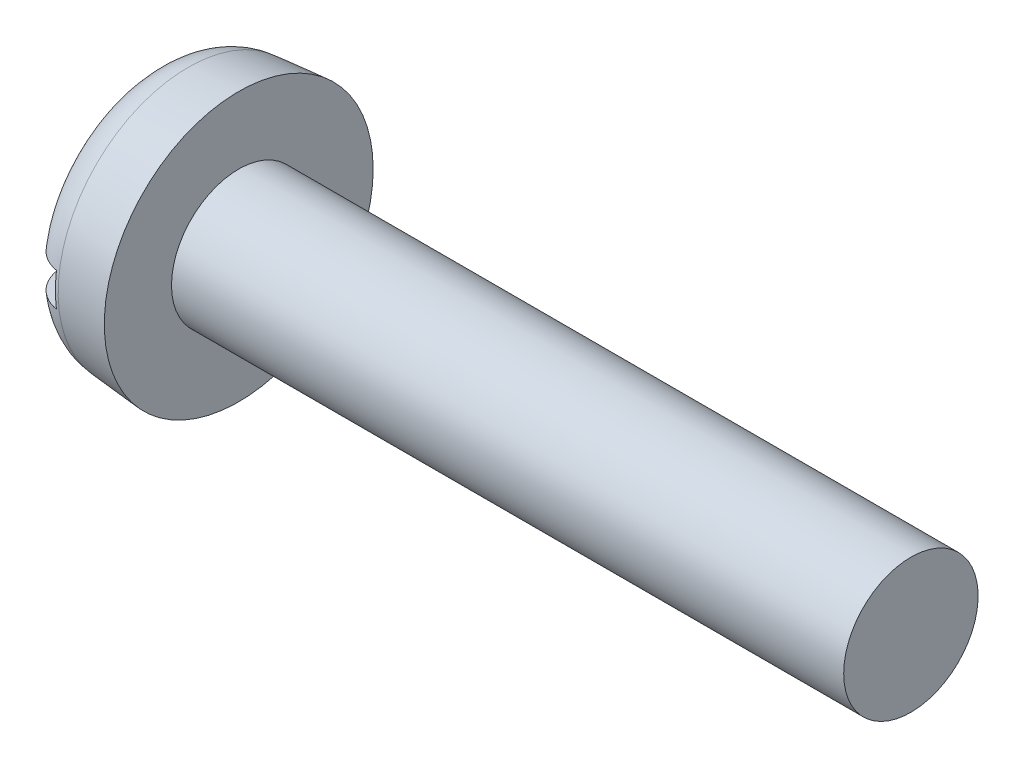
ISO-10303-21;
HEADER;
FILE_DESCRIPTION(('STEP AP214'),'2;1');
FILE_NAME('part.step','',(''),(''),'','','');
FILE_SCHEMA(('AUTOMOTIVE_DESIGN { 1 0 10303 214 1 1 1 1 }'));
ENDSEC;
DATA;
#1=APPLICATION_CONTEXT('core data for automotive mechanical design processes');
#2=APPLICATION_PROTOCOL_DEFINITION('international standard','automotive_design',2000,#1);
#3=PRODUCT_CONTEXT('',#1,'mechanical');
#4=PRODUCT('Part','Part','',(#3));
#5=PRODUCT_RELATED_PRODUCT_CATEGORY('part','',(#4));
#6=PRODUCT_DEFINITION_FORMATION('','',#4);
#7=PRODUCT_DEFINITION_CONTEXT('part definition',#1,'design');
#8=PRODUCT_DEFINITION('design','',#6,#7);
#9=PRODUCT_DEFINITION_SHAPE('','',#8);
#10=(LENGTH_UNIT() NAMED_UNIT(*) SI_UNIT(.MILLI.,.METRE.));
#11=(NAMED_UNIT(*) PLANE_ANGLE_UNIT() SI_UNIT($,.RADIAN.));
#12=(NAMED_UNIT(*) SI_UNIT($,.STERADIAN.) SOLID_ANGLE_UNIT());
#13=UNCERTAINTY_MEASURE_WITH_UNIT(LENGTH_MEASURE(1.E-05),#10,'distance_accuracy_value','');
#14=(GEOMETRIC_REPRESENTATION_CONTEXT(3) GLOBAL_UNCERTAINTY_ASSIGNED_CONTEXT((#13)) GLOBAL_UNIT_ASSIGNED_CONTEXT((#10,
#11,#12)) REPRESENTATION_CONTEXT('',''));
#15=CARTESIAN_POINT('',(0.,0.,0.));
#16=DIRECTION('',(0.,0.,1.));
#17=DIRECTION('',(1.,0.,0.));
#18=AXIS2_PLACEMENT_3D('',#15,#16,#17);
#19=CARTESIAN_POINT('',(0.,0.,0.));
#20=DIRECTION('',(-0.999999999999999,0.,0.));
#21=DIRECTION('',(0.,0.,1.));
#22=AXIS2_PLACEMENT_3D('',#19,#20,#21);
#23=PLANE('',#22);
#24=DIRECTION('',(0.,0.,-1.));
#25=VECTOR('',#24,1.);
#26=CARTESIAN_POINT('',(1.38777878078145E-13,0.25,2.));
#27=LINE('',#26,#25);
#28=CARTESIAN_POINT('',(1.38777878078145E-13,0.25,1.31287526344981));
#29=VERTEX_POINT('',#28);
#30=CARTESIAN_POINT('',(1.38777878078145E-13,0.249999999999993,-1.31287526344981));
#31=VERTEX_POINT('',#30);
#32=EDGE_CURVE('E95',#29,#31,#27,.T.);
#33=ORIENTED_EDGE('',*,*,#32,.F.);
#34=CARTESIAN_POINT('',(0.,0.,0.));
#35=DIRECTION('',(-0.999999999999999,0.,0.));
#36=DIRECTION('',(0.,0.,1.));
#37=AXIS2_PLACEMENT_3D('',#34,#35,#36);
#38=CIRCLE('',#37,1.33646603300584);
#39=EDGE_CURVE('E102',#29,#31,#38,.T.);
#40=ORIENTED_EDGE('',*,*,#39,.T.);
#41=EDGE_LOOP('',(#33,#40));
#42=FACE_BOUND('',#41,.T.);
#43=ADVANCED_FACE('F38',(#42),#23,.T.);
#44=CARTESIAN_POINT('',(-25.4,0.,0.));
#45=DIRECTION('',(-0.999999999999999,0.,0.));
#46=DIRECTION('',(0.,0.,1.));
#47=AXIS2_PLACEMENT_3D('',#44,#45,#46);
#48=CYLINDRICAL_SURFACE('',#47,1.);
#49=CARTESIAN_POINT('',(11.3,-1.2490009027033E-13,0.));
#50=DIRECTION('',(-0.999999999999999,0.,0.));
#51=DIRECTION('',(0.,0.,1.));
#52=AXIS2_PLACEMENT_3D('',#49,#50,#51);
#53=CIRCLE('',#52,1.);
#54=CARTESIAN_POINT('',(11.3,0.,0.999999999999997));
#55=VERTEX_POINT('',#54);
#56=EDGE_CURVE('E103',#55,#55,#53,.T.);
#57=CARTESIAN_POINT('',(1.3,-1.11022302462516E-13,0.));
#58=DIRECTION('',(-0.999999999999999,0.,0.));
#59=DIRECTION('',(0.,0.,1.));
#60=AXIS2_PLACEMENT_3D('',#57,#58,#59);
#61=CIRCLE('',#60,1.);
#62=CARTESIAN_POINT('',(1.3,0.,0.999999999999998));
#63=VERTEX_POINT('',#62);
#64=EDGE_CURVE('E169',#63,#63,#61,.T.);
#65=CARTESIAN_POINT('',(11.3,0.,0.999999999999997));
#66=CARTESIAN_POINT('',(11.1958333333333,0.,0.999999999999997));
#67=CARTESIAN_POINT('',(11.0916666666667,0.,0.999999999999997));
#68=CARTESIAN_POINT('',(10.8833333333333,0.,0.999999999999997));
#69=CARTESIAN_POINT('',(10.7791666666667,0.,0.999999999999997));
#70=CARTESIAN_POINT('',(10.5708333333333,0.,0.999999999999997));
#71=CARTESIAN_POINT('',(10.4666666666667,0.,0.999999999999997));
#72=CARTESIAN_POINT('',(10.2583333333333,0.,0.999999999999997));
#73=CARTESIAN_POINT('',(10.1541666666667,0.,0.999999999999997));
#74=CARTESIAN_POINT('',(9.94583333333334,0.,0.999999999999997));
#75=CARTESIAN_POINT('',(9.84166666666668,0.,0.999999999999997));
#76=CARTESIAN_POINT('',(9.63333333333334,0.,0.999999999999997));
#77=CARTESIAN_POINT('',(9.52916666666668,0.,0.999999999999997));
#78=CARTESIAN_POINT('',(9.32083333333334,0.,0.999999999999997));
#79=CARTESIAN_POINT('',(9.21666666666668,0.,0.999999999999997));
#80=CARTESIAN_POINT('',(9.00833333333334,0.,0.999999999999997));
#81=CARTESIAN_POINT('',(8.90416666666668,0.,0.999999999999997));
#82=CARTESIAN_POINT('',(8.69583333333334,0.,0.999999999999997));
#83=CARTESIAN_POINT('',(8.59166666666667,0.,0.999999999999997));
#84=CARTESIAN_POINT('',(8.38333333333333,0.,0.999999999999997));
#85=CARTESIAN_POINT('',(8.27916666666667,0.,0.999999999999997));
#86=CARTESIAN_POINT('',(8.07083333333333,0.,0.999999999999997));
#87=CARTESIAN_POINT('',(7.96666666666667,0.,0.999999999999997));
#88=CARTESIAN_POINT('',(7.75833333333333,0.,0.999999999999997));
#89=CARTESIAN_POINT('',(7.65416666666667,0.,0.999999999999997));
#90=CARTESIAN_POINT('',(7.44583333333333,0.,0.999999999999997));
#91=CARTESIAN_POINT('',(7.34166666666667,0.,0.999999999999997));
#92=CARTESIAN_POINT('',(7.13333333333333,0.,0.999999999999997));
#93=CARTESIAN_POINT('',(7.02916666666667,0.,0.999999999999997));
#94=CARTESIAN_POINT('',(6.82083333333333,0.,0.999999999999997));
#95=CARTESIAN_POINT('',(6.71666666666667,0.,0.999999999999997));
#96=CARTESIAN_POINT('',(6.50833333333333,0.,0.999999999999997));
#97=CARTESIAN_POINT('',(6.40416666666667,0.,0.999999999999997));
#98=CARTESIAN_POINT('',(6.19583333333333,0.,0.999999999999997));
#99=CARTESIAN_POINT('',(6.09166666666667,0.,0.999999999999997));
#100=CARTESIAN_POINT('',(5.88333333333333,0.,0.999999999999997));
#101=CARTESIAN_POINT('',(5.77916666666667,0.,0.999999999999997));
#102=CARTESIAN_POINT('',(5.57083333333334,0.,0.999999999999997));
#103=CARTESIAN_POINT('',(5.46666666666667,0.,0.999999999999997));
#104=CARTESIAN_POINT('',(5.25833333333334,0.,0.999999999999997));
#105=CARTESIAN_POINT('',(5.15416666666667,0.,0.999999999999997));
#106=CARTESIAN_POINT('',(4.94583333333334,0.,0.999999999999997));
#107=CARTESIAN_POINT('',(4.84166666666667,0.,0.999999999999997));
#108=CARTESIAN_POINT('',(4.63333333333334,0.,0.999999999999997));
#109=CARTESIAN_POINT('',(4.52916666666667,0.,0.999999999999998));
#110=CARTESIAN_POINT('',(4.32083333333334,0.,0.999999999999998));
#111=CARTESIAN_POINT('',(4.21666666666667,0.,0.999999999999998));
#112=CARTESIAN_POINT('',(4.00833333333334,0.,0.999999999999998));
#113=CARTESIAN_POINT('',(3.90416666666667,0.,0.999999999999998));
#114=CARTESIAN_POINT('',(3.69583333333333,0.,0.999999999999998));
#115=CARTESIAN_POINT('',(3.59166666666667,0.,0.999999999999998));
#116=CARTESIAN_POINT('',(3.38333333333333,0.,0.999999999999998));
#117=CARTESIAN_POINT('',(3.27916666666667,0.,0.999999999999998));
#118=CARTESIAN_POINT('',(3.07083333333333,0.,0.999999999999998));
#119=CARTESIAN_POINT('',(2.96666666666666,0.,0.999999999999998));
#120=CARTESIAN_POINT('',(2.75833333333333,0.,0.999999999999998));
#121=CARTESIAN_POINT('',(2.65416666666666,0.,0.999999999999998));
#122=CARTESIAN_POINT('',(2.44583333333333,0.,0.999999999999998));
#123=CARTESIAN_POINT('',(2.34166666666667,0.,0.999999999999998));
#124=CARTESIAN_POINT('',(2.13333333333333,0.,0.999999999999998));
#125=CARTESIAN_POINT('',(2.02916666666667,0.,0.999999999999998));
#126=CARTESIAN_POINT('',(1.82083333333333,0.,0.999999999999998));
#127=CARTESIAN_POINT('',(1.71666666666667,0.,0.999999999999998));
#128=CARTESIAN_POINT('',(1.50833333333333,0.,0.999999999999998));
#129=CARTESIAN_POINT('',(1.40416666666667,0.,0.999999999999998));
#130=CARTESIAN_POINT('',(1.3,0.,0.999999999999998));
#131=B_SPLINE_CURVE_WITH_KNOTS('',3,(#65,#66,#67,#68,#69,#70,#71,#72,#73,#74,#75,#76,#77,#78,
#79,#80,#81,#82,#83,#84,#85,#86,#87,#88,#89,#90,#91,#92,#93,#94,#95,#96,#97,#98,#99,#100,#101,
#102,#103,#104,#105,#106,#107,#108,#109,#110,#111,#112,#113,#114,#115,#116,#117,#118,#119,#120,
#121,#122,#123,#124,#125,#126,#127,#128,#129,#130),.UNSPECIFIED.,.F.,.F.,(4,2,2,2,2,2,2,2,2,2,2,
2,2,2,2,2,2,2,2,2,2,2,2,2,2,2,2,2,2,2,2,2,4),(0.,0.3125,0.625000000000001,0.937499999999994,
1.24999999999999,1.56249999999999,1.87499999999999,2.1875,2.5,2.8125,3.125,3.4375,3.75,4.0625,
4.375,4.6875,5.,5.3125,5.625,5.9375,6.25,6.5625,6.875,7.1875,7.5,7.8125,8.125,8.43750000000001,
8.75000000000001,9.06250000000001,9.37500000000001,9.68750000000001,10.),.UNSPECIFIED.);
#132=EDGE_CURVE('BSEAM157',#55,#63,#131,.T.);
#133=ORIENTED_EDGE('',*,*,#56,.T.);
#134=ORIENTED_EDGE('',*,*,#64,.F.);
#135=ORIENTED_EDGE('',*,*,#132,.T.);
#136=ORIENTED_EDGE('',*,*,#132,.F.);
#137=EDGE_LOOP('',(#133,#135,#134,#136));
#138=FACE_BOUND('',#137,.T.);
#139=ADVANCED_FACE('F157',(#138),#48,.T.);
#140=CARTESIAN_POINT('',(11.3000000000002,0.999999999999897,0.));
#141=DIRECTION('',(0.999999999999999,0.,0.));
#142=DIRECTION('',(0.,0.,-1.));
#143=AXIS2_PLACEMENT_3D('',#140,#141,#142);
#144=PLANE('',#143);
#145=ORIENTED_EDGE('',*,*,#56,.F.);
#146=EDGE_LOOP('',(#145));
#147=FACE_BOUND('',#146,.T.);
#148=ADVANCED_FACE('F155',(#147),#144,.T.);
#149=DIRECTION('',(0.,0.,1.));
#150=VECTOR('',#149,1.);
#151=CARTESIAN_POINT('',(-1.11022302462516E-13,-0.250000000000007,-2.));
#152=LINE('',#151,#150);
#153=CARTESIAN_POINT('',(-3.05311331771918E-13,-0.250000000000007,-1.31287526344981));
#154=VERTEX_POINT('',#153);
#155=CARTESIAN_POINT('',(-3.05311331771918E-13,-0.25,1.31287526344981));
#156=VERTEX_POINT('',#155);
#157=EDGE_CURVE('E84',#154,#156,#152,.T.);
#158=ORIENTED_EDGE('',*,*,#157,.F.);
#159=EDGE_CURVE('E92',#154,#156,#38,.T.);
#160=ORIENTED_EDGE('',*,*,#159,.T.);
#161=EDGE_LOOP('',(#158,#160));
#162=FACE_BOUND('',#161,.T.);
#163=ADVANCED_FACE('F91',(#162),#23,.T.);
#164=CARTESIAN_POINT('',(0.,0.,0.));
#165=DIRECTION('',(0.999999999999999,0.,0.));
#166=DIRECTION('',(0.,0.,-1.));
#167=AXIS2_PLACEMENT_3D('',#164,#165,#166);
#168=CONICAL_SURFACE('',#167,1.8862647374163,0.0872664625997168);
#169=CARTESIAN_POINT('',(0.547706554351407,0.,0.));
#170=DIRECTION('',(-0.999999999999999,0.,0.));
#171=DIRECTION('',(0.,0.,1.));
#172=AXIS2_PLACEMENT_3D('',#169,#170,#171);
#173=CIRCLE('',#172,1.93418285186089);
#174=CARTESIAN_POINT('',(0.547706554351407,0.,-1.93418285186089));
#175=VERTEX_POINT('',#174);
#176=EDGE_CURVE('E109',#175,#175,#173,.F.);
#177=CARTESIAN_POINT('',(1.3,-1.11022302462516E-13,0.));
#178=DIRECTION('',(-0.999999999999999,0.,0.));
#179=DIRECTION('',(0.,0.,1.));
#180=AXIS2_PLACEMENT_3D('',#177,#178,#179);
#181=CIRCLE('',#180,2.);
#182=CARTESIAN_POINT('',(1.3,0.,-2.));
#183=VERTEX_POINT('',#182);
#184=EDGE_CURVE('E111',#183,#183,#181,.T.);
#185=CARTESIAN_POINT('',(0.547706554351407,0.,-1.93418285186089));
#186=CARTESIAN_POINT('',(0.555542944410246,0.,-1.93486844715401));
#187=CARTESIAN_POINT('',(0.563379334469086,0.,-1.93555404244712));
#188=CARTESIAN_POINT('',(0.579052114586765,0.,-1.93692523303335));
#189=CARTESIAN_POINT('',(0.586888504645604,0.,-1.93761082832647));
#190=CARTESIAN_POINT('',(0.602561284763283,0.,-1.9389820189127));
#191=CARTESIAN_POINT('',(0.610397674822123,0.,-1.93966761420582));
#192=CARTESIAN_POINT('',(0.626070454939802,0.,-1.94103880479205));
#193=CARTESIAN_POINT('',(0.633906844998641,0.,-1.94172440008517));
#194=CARTESIAN_POINT('',(0.64957962511632,0.,-1.9430955906714));
#195=CARTESIAN_POINT('',(0.657416015175159,0.,-1.94378118596451));
#196=CARTESIAN_POINT('',(0.673088795292838,0.,-1.94515237655074));
#197=CARTESIAN_POINT('',(0.680925185351678,0.,-1.94583797184386));
#198=CARTESIAN_POINT('',(0.696597965469357,0.,-1.94720916243009));
#199=CARTESIAN_POINT('',(0.704434355528196,0.,-1.94789475772321));
#200=CARTESIAN_POINT('',(0.720107135645875,0.,-1.94926594830944));
#201=CARTESIAN_POINT('',(0.727943525704715,0.,-1.94995154360255));
#202=CARTESIAN_POINT('',(0.743616305822393,0.,-1.95132273418878));
#203=CARTESIAN_POINT('',(0.751452695881233,0.,-1.9520083294819));
#204=CARTESIAN_POINT('',(0.767125475998912,0.,-1.95337952006813));
#205=CARTESIAN_POINT('',(0.774961866057751,0.,-1.95406511536125));
#206=CARTESIAN_POINT('',(0.79063464617543,0.,-1.95543630594748));
#207=CARTESIAN_POINT('',(0.79847103623427,0.,-1.95612190124059));
#208=CARTESIAN_POINT('',(0.814143816351949,0.,-1.95749309182683));
#209=CARTESIAN_POINT('',(0.821980206410788,0.,-1.95817868711994));
#210=CARTESIAN_POINT('',(0.837652986528467,0.,-1.95954987770617));
#211=CARTESIAN_POINT('',(0.845489376587306,0.,-1.96023547299929));
#212=CARTESIAN_POINT('',(0.861162156704985,0.,-1.96160666358552));
#213=CARTESIAN_POINT('',(0.868998546763825,0.,-1.96229225887864));
#214=CARTESIAN_POINT('',(0.884671326881504,0.,-1.96366344946487));
#215=CARTESIAN_POINT('',(0.892507716940343,0.,-1.96434904475798));
#216=CARTESIAN_POINT('',(0.908180497058022,0.,-1.96572023534421));
#217=CARTESIAN_POINT('',(0.916016887116862,0.,-1.96640583063733));
#218=CARTESIAN_POINT('',(0.931689667234541,0.,-1.96777702122356));
#219=CARTESIAN_POINT('',(0.93952605729338,0.,-1.96846261651668));
#220=CARTESIAN_POINT('',(0.955198837411059,0.,-1.96983380710291));
#221=CARTESIAN_POINT('',(0.963035227469898,0.,-1.97051940239602));
#222=CARTESIAN_POINT('',(0.978708007587577,0.,-1.97189059298226));
#223=CARTESIAN_POINT('',(0.986544397646417,0.,-1.97257618827537));
#224=CARTESIAN_POINT('',(1.0022171777641,0.,-1.9739473788616));
#225=CARTESIAN_POINT('',(1.01005356782294,0.,-1.97463297415472));
#226=CARTESIAN_POINT('',(1.02572634794061,0.,-1.97600416474095));
#227=CARTESIAN_POINT('',(1.03356273799945,0.,-1.97668976003407));
#228=CARTESIAN_POINT('',(1.04923551811713,0.,-1.9780609506203));
#229=CARTESIAN_POINT('',(1.05707190817597,0.,-1.97874654591341));
#230=CARTESIAN_POINT('',(1.07274468829365,0.,-1.98011773649964));
#231=CARTESIAN_POINT('',(1.08058107835249,0.,-1.98080333179276));
#232=CARTESIAN_POINT('',(1.09625385847017,0.,-1.98217452237899));
#233=CARTESIAN_POINT('',(1.10409024852901,0.,-1.98286011767211));
#234=CARTESIAN_POINT('',(1.11976302864669,0.,-1.98423130825834));
#235=CARTESIAN_POINT('',(1.12759941870553,0.,-1.98491690355145));
#236=CARTESIAN_POINT('',(1.14327219882321,0.,-1.98628809413769));
#237=CARTESIAN_POINT('',(1.15110858888205,0.,-1.9869736894308));
#238=CARTESIAN_POINT('',(1.16678136899972,0.,-1.98834488001703));
#239=CARTESIAN_POINT('',(1.17461775905856,0.,-1.98903047531015));
#240=CARTESIAN_POINT('',(1.19029053917624,0.,-1.99040166589638));
#241=CARTESIAN_POINT('',(1.19812692923508,0.,-1.9910872611895));
#242=CARTESIAN_POINT('',(1.21379970935276,0.,-1.99245845177573));
#243=CARTESIAN_POINT('',(1.2216360994116,0.,-1.99314404706884));
#244=CARTESIAN_POINT('',(1.23730887952928,0.,-1.99451523765507));
#245=CARTESIAN_POINT('',(1.24514526958812,0.,-1.99520083294819));
#246=CARTESIAN_POINT('',(1.2608180497058,0.,-1.99657202353442));
#247=CARTESIAN_POINT('',(1.26865443976464,0.,-1.99725761882754));
#248=CARTESIAN_POINT('',(1.28432721988232,0.,-1.99862880941377));
#249=CARTESIAN_POINT('',(1.29216360994116,0.,-1.99931440470688));
#250=CARTESIAN_POINT('',(1.3,0.,-2.));
#251=B_SPLINE_CURVE_WITH_KNOTS('',3,(#185,#186,#187,#188,#189,#190,#191,#192,#193,#194,#195,
#196,#197,#198,#199,#200,#201,#202,#203,#204,#205,#206,#207,#208,#209,#210,#211,#212,#213,#214,
#215,#216,#217,#218,#219,#220,#221,#222,#223,#224,#225,#226,#227,#228,#229,#230,#231,#232,#233,
#234,#235,#236,#237,#238,#239,#240,#241,#242,#243,#244,#245,#246,#247,#248,#249,#250),
.UNSPECIFIED.,.F.,.F.,(4,2,2,2,2,2,2,2,2,2,2,2,2,2,2,2,2,2,2,2,2,2,2,2,2,2,2,2,2,2,2,2,4),(0.,
0.0235989713873715,0.0471979427747432,0.0707969141621148,0.0943958855494863,0.117994856936858,
0.14159382832423,0.165192799711601,0.188791771098973,0.212390742486344,0.235989713873716,
0.259588685261088,0.283187656648459,0.306786628035831,0.330385599423202,0.353984570810574,
0.377583542197945,0.401182513585317,0.424781484972689,0.44838045636006,0.471979427747432,
0.495578399134803,0.519177370522175,0.542776341909547,0.566375313296918,0.58997428468429,
0.613573256071661,0.637172227459033,0.660771198846405,0.684370170233776,0.707969141621148,
0.731568113008519,0.755167084395891),.UNSPECIFIED.);
#252=EDGE_CURVE('BSEAM148',#175,#183,#251,.T.);
#253=ORIENTED_EDGE('',*,*,#176,.T.);
#254=ORIENTED_EDGE('',*,*,#184,.T.);
#255=ORIENTED_EDGE('',*,*,#252,.T.);
#256=ORIENTED_EDGE('',*,*,#252,.F.);
#257=EDGE_LOOP('',(#253,#255,#254,#256));
#258=FACE_BOUND('',#257,.T.);
#259=ADVANCED_FACE('F148',(#258),#168,.T.);
#260=CARTESIAN_POINT('',(1.30000000000027,0.99999999999989,0.));
#261=DIRECTION('',(-0.999999999999999,0.,0.));
#262=DIRECTION('',(0.,0.,1.));
#263=AXIS2_PLACEMENT_3D('',#260,#261,#262);
#264=PLANE('',#263);
#265=ORIENTED_EDGE('',*,*,#184,.F.);
#266=EDGE_LOOP('',(#265));
#267=FACE_BOUND('',#266,.T.);
#268=ORIENTED_EDGE('',*,*,#64,.T.);
#269=EDGE_LOOP('',(#268));
#270=FACE_BOUND('',#269,.T.);
#271=ADVANCED_FACE('F144',(#267,#270),#264,.F.);
#272=CARTESIAN_POINT('',(0.599999999999989,0.,0.));
#273=DIRECTION('',(-0.999999999999999,0.,0.));
#274=DIRECTION('',(0.,0.,1.));
#275=AXIS2_PLACEMENT_3D('',#272,#273,#274);
#276=TOROIDAL_SURFACE('',#275,1.33646603300584,0.6);
#277=CARTESIAN_POINT('',(0.274780655200257,0.25,-1.82362420667531));
#278=CARTESIAN_POINT('',(0.302850124065542,0.250000000000002,-1.84189666141679));
#279=CARTESIAN_POINT('',(0.33247691283615,0.250000000000001,-1.85782010480747));
#280=CARTESIAN_POINT('',(0.394006386294808,0.25,-1.88448283873066));
#281=CARTESIAN_POINT('',(0.425911622330511,0.25,-1.89521620967585));
#282=CARTESIAN_POINT('',(0.491065421711298,0.250000000000001,-1.91116335358417));
#283=CARTESIAN_POINT('',(0.524313546486191,0.250000000000002,-1.91637891370101));
#284=CARTESIAN_POINT('',(0.591204792683726,0.249999999999998,-1.92113959303414));
#285=CARTESIAN_POINT('',(0.624847818162057,0.249999999999992,-1.92068606223461));
#286=CARTESIAN_POINT('',(0.691513871966677,0.250000000000008,-1.91413229696865));
#287=CARTESIAN_POINT('',(0.724537965843717,0.25000000000003,-1.90804289638479));
#288=CARTESIAN_POINT('',(0.789097481854362,0.24999999999997,-1.89041111372301));
#289=CARTESIAN_POINT('',(0.820632856008582,0.249999999999889,-1.87886855602914));
#290=CARTESIAN_POINT('',(0.881355504744787,0.249999999999889,-1.85065407323915));
#291=CARTESIAN_POINT('',(0.910540461536804,0.249999999999971,-1.83397716134264));
#292=CARTESIAN_POINT('',(0.965713973197622,0.25000000000003,-1.79598321604754));
#293=CARTESIAN_POINT('',(0.991702483157344,0.250000000000007,-1.77466611746744));
#294=CARTESIAN_POINT('',(1.03989067692421,0.249999999999994,-1.72788939986323));
#295=CARTESIAN_POINT('',(1.06207077173721,0.250000000000003,-1.70240960587083));
#296=CARTESIAN_POINT('',(1.10188385808009,0.249999999999997,-1.64811708765423));
#297=CARTESIAN_POINT('',(1.11951669564422,0.249999999999983,-1.61930425062423));
#298=CARTESIAN_POINT('',(1.14991644325,0.24999999999999,-1.55888388907362));
#299=CARTESIAN_POINT('',(1.16263701266531,0.250000000000013,-1.5272530565323));
#300=CARTESIAN_POINT('',(1.18266472006596,0.249999999999988,-1.4623229058699));
#301=CARTESIAN_POINT('',(1.18997153304387,0.24999999999994,-1.42902348770568));
#302=CARTESIAN_POINT('',(1.19907574671247,0.249999999999936,-1.36122512528323));
#303=CARTESIAN_POINT('',(1.20079785339318,0.249999999999981,-1.32671607825362));
#304=CARTESIAN_POINT('',(1.19852158611445,0.250000000000019,-1.2578879596417));
#305=CARTESIAN_POINT('',(1.19452272743375,0.250000000000013,-1.22356890440419));
#306=CARTESIAN_POINT('',(1.18084584012605,0.250000000000002,-1.15550299104833));
#307=CARTESIAN_POINT('',(1.17107689801161,0.249999999999998,-1.12177439719902));
#308=CARTESIAN_POINT('',(1.14608963326823,0.250000000000003,-1.05639845281477));
#309=CARTESIAN_POINT('',(1.13087072283904,0.250000000000012,-1.02475132721022));
#310=CARTESIAN_POINT('',(1.09517672424954,0.250000000000002,-0.964015185217617));
#311=CARTESIAN_POINT('',(1.0746358511616,0.249999999999983,-0.934964791126747));
#312=CARTESIAN_POINT('',(1.02894686112375,0.250000000000017,-0.880736843040474));
#313=CARTESIAN_POINT('',(1.00379831827959,0.250000000000072,-0.855559647447063));
#314=CARTESIAN_POINT('',(0.949690395648305,0.250000000000081,-0.809995267822484));
#315=CARTESIAN_POINT('',(0.920750663668163,0.250000000000038,-0.789584802369767));
#316=CARTESIAN_POINT('',(0.859743350232011,0.249999999999963,-0.754142685467569));
#317=CARTESIAN_POINT('',(0.827676707896934,0.249999999999931,-0.739109425347795));
#318=CARTESIAN_POINT('',(0.762667368563436,0.249999999999944,-0.715550940340582));
#319=CARTESIAN_POINT('',(0.729809776019521,0.249999999999986,-0.7067913740996));
#320=CARTESIAN_POINT('',(0.663065073704921,0.250000000000014,-0.695254567881));
#321=CARTESIAN_POINT('',(0.629178416423587,0.25,-0.692474736103994));
#322=CARTESIAN_POINT('',(0.563211392329661,0.249999999999987,-0.69302023476353));
#323=CARTESIAN_POINT('',(0.531128042957623,0.249999999999989,-0.696037951412169));
#324=CARTESIAN_POINT('',(0.467930020079968,0.250000000000012,-0.70743261691846));
#325=CARTESIAN_POINT('',(0.436815388934229,0.250000000000033,-0.715809799789368));
#326=CARTESIAN_POINT('',(0.376446381647234,0.250000000000037,-0.737546549416794));
#327=CARTESIAN_POINT('',(0.347188974627637,0.250000000000018,-0.750897740764997));
#328=CARTESIAN_POINT('',(0.291181449852527,0.249999999999982,-0.78209639374003));
#329=CARTESIAN_POINT('',(0.264431855473838,0.249999999999964,-0.799944791073745));
#330=CARTESIAN_POINT('',(0.212801122052525,0.249999999999967,-0.840563479123878));
#331=CARTESIAN_POINT('',(0.188076305161133,0.249999999999991,-0.863532471122602));
#332=CARTESIAN_POINT('',(0.142632089074603,0.250000000000009,-0.913140155498274));
#333=CARTESIAN_POINT('',(0.12191354438123,0.250000000000003,-0.939779628685335));
#334=CARTESIAN_POINT('',(0.0841798141604548,0.249999999999998,-0.997238681509961));
#335=CARTESIAN_POINT('',(0.0673637911083523,0.249999999999999,-1.02818930073666));
#336=CARTESIAN_POINT('',(0.0390991703503589,0.250000000000001,-1.0924531159164));
#337=CARTESIAN_POINT('',(0.0276510234355653,0.250000000000001,-1.12576651002353));
#338=CARTESIAN_POINT('',(0.0103722361803067,0.25,-1.19421384118876));
#339=CARTESIAN_POINT('',(0.00460478662294875,0.249999999999998,-1.22936377570471));
#340=CARTESIAN_POINT('',(-0.00087867915112119,0.250000000000002,-1.30013265464534));
#341=CARTESIAN_POINT('',(-0.000595165423992064,0.250000000000007,-1.335751562424));
#342=CARTESIAN_POINT('',(0.00602927957059926,0.249999999999993,-1.40603493785941));
#343=CARTESIAN_POINT('',(0.0123048116822748,0.249999999999974,-1.44070555722836));
#344=CARTESIAN_POINT('',(0.0306887868415254,0.250000000000026,-1.50847558350852));
#345=CARTESIAN_POINT('',(0.0427982176917977,0.250000000000099,-1.54157472329191));
#346=CARTESIAN_POINT('',(0.0722935157775222,0.250000000000096,-1.60468559872415));
#347=CARTESIAN_POINT('',(0.0895922457386841,0.250000000000023,-1.63473812116026));
#348=CARTESIAN_POINT('',(0.129048154505377,0.249999999999977,-1.69142667080821));
#349=CARTESIAN_POINT('',(0.151198946684517,0.250000000000004,-1.71806711686358));
#350=CARTESIAN_POINT('',(0.190498702041481,0.250000000000009,-1.75782741941756));
#351=CARTESIAN_POINT('',(0.206359023192101,0.250000000000003,-1.77224346176925));
#352=CARTESIAN_POINT('',(0.239527629180714,0.249999999999998,-1.79930107726035));
#353=CARTESIAN_POINT('',(0.256835902453637,0.249999999999999,-1.81194266457049));
#354=CARTESIAN_POINT('',(0.274780655200257,0.25,-1.82362420667531));
#355=B_SPLINE_CURVE_WITH_KNOTS('',3,(#277,#278,#279,#280,#281,#282,#283,#284,#285,#286,#287,
#288,#289,#290,#291,#292,#293,#294,#295,#296,#297,#298,#299,#300,#301,#302,#303,#304,#305,#306,
#307,#308,#309,#310,#311,#312,#313,#314,#315,#316,#317,#318,#319,#320,#321,#322,#323,#324,#325,
#326,#327,#328,#329,#330,#331,#332,#333,#334,#335,#336,#337,#338,#339,#340,#341,#342,#343,#344,
#345,#346,#347,#348,#349,#350,#351,#352,#353,#354),.UNSPECIFIED.,.T.,.F.,(4,2,2,2,2,2,2,2,2,2,2,
2,2,2,2,2,2,2,2,2,2,2,2,2,2,2,2,2,2,2,2,2,2,2,2,2,2,2,4),(0.,0.100401062182579,
0.200916369230918,0.301399110583016,0.401857924372671,0.50212402549457,0.602393355851692,
0.70276038283154,0.803128819775644,0.903998978686847,1.00487255251626,1.10667574998271,
1.20848505856896,1.31166139334779,1.41484647048433,1.51970240948545,1.62456966101418,
1.73080076101004,1.83704168507411,1.94275232230142,2.04843130812937,2.14992147627127,
2.2513676466065,2.34757938832311,2.44379533127149,2.53984998938429,2.63592464954522,
2.73671855873461,2.83753394270025,2.94271393649613,3.04790276166503,3.15424889662288,
3.26058677033843,3.36577714242796,3.47098533174002,3.57451735589252,3.67791391414107,
3.74210061585796,3.80628680495228),.UNSPECIFIED.);
#356=CARTESIAN_POINT('',(0.499999999999917,0.250000000000007,-1.91179742470571));
#357=VERTEX_POINT('',#356);
#358=EDGE_CURVE('E11',#31,#357,#355,.T.);
#359=ORIENTED_EDGE('',*,*,#358,.F.);
#360=ORIENTED_EDGE('',*,*,#39,.F.);
#361=CARTESIAN_POINT('',(0.256477971267433,0.25,0.806687931408367));
#362=CARTESIAN_POINT('',(0.283073772587587,0.250000000000001,0.787245268924248));
#363=CARTESIAN_POINT('',(0.311256734673681,0.25,0.769944535846673));
#364=CARTESIAN_POINT('',(0.370114008258109,0.25,0.740229039319253));
#365=CARTESIAN_POINT('',(0.400789824440756,0.25,0.727817253657542));
#366=CARTESIAN_POINT('',(0.463871915221618,0.250000000000001,0.708374903085699));
#367=CARTESIAN_POINT('',(0.496281146765479,0.250000000000002,0.701353868838664));
#368=CARTESIAN_POINT('',(0.5618200795292,0.249999999999998,0.693064165401123));
#369=CARTESIAN_POINT('',(0.594949507008858,0.249999999999992,0.691793347727704));
#370=CARTESIAN_POINT('',(0.659868599580598,0.250000000000008,0.695008568960632));
#371=CARTESIAN_POINT('',(0.691667437306344,0.25000000000003,0.699313344775904));
#372=CARTESIAN_POINT('',(0.754098929301054,0.24999999999997,0.713169938820356));
#373=CARTESIAN_POINT('',(0.784731434429447,0.24999999999989,0.72272242568821));
#374=CARTESIAN_POINT('',(0.844220886452073,0.249999999999889,0.74676075098344));
#375=CARTESIAN_POINT('',(0.873064893626645,0.24999999999997,0.761278483323733));
#376=CARTESIAN_POINT('',(0.928072070248436,0.25000000000003,0.79471920620755));
#377=CARTESIAN_POINT('',(0.954234673131086,0.250000000000008,0.81364312499942));
#378=CARTESIAN_POINT('',(1.00455764012349,0.249999999999992,0.856403426025705));
#379=CARTESIAN_POINT('',(1.02854601727964,0.249999999999998,0.880442281861881));
#380=CARTESIAN_POINT('',(1.0723396905591,0.250000000000002,0.932069110637422));
#381=CARTESIAN_POINT('',(1.09214414470062,0.249999999999999,0.959657796158235));
#382=CARTESIAN_POINT('',(1.12778060572239,0.250000000000001,1.01880991735135));
#383=CARTESIAN_POINT('',(1.14342273788472,0.250000000000006,1.05048797462787));
#384=CARTESIAN_POINT('',(1.16921417457243,0.249999999999995,1.11600811372881));
#385=CARTESIAN_POINT('',(1.17936312023967,0.24999999999998,1.1498503367721));
#386=CARTESIAN_POINT('',(1.19390640883492,0.249999999999979,1.21901855241694));
#387=CARTESIAN_POINT('',(1.19825699097698,0.249999999999995,1.25435377468584));
#388=CARTESIAN_POINT('',(1.20088701701163,0.250000000000006,1.32525082928571));
#389=CARTESIAN_POINT('',(1.19916675302165,0.250000000000002,1.36081265063097));
#390=CARTESIAN_POINT('',(1.18971168250484,0.249999999999999,1.43069187166978));
#391=CARTESIAN_POINT('',(1.18204966947665,0.249999999999999,1.46501910735439));
#392=CARTESIAN_POINT('',(1.16097413489612,0.250000000000001,1.53186104297241));
#393=CARTESIAN_POINT('',(1.14756110125126,0.250000000000002,1.5643758964011));
#394=CARTESIAN_POINT('',(1.11560510746255,0.249999999999985,1.62610187095565));
#395=CARTESIAN_POINT('',(1.09714995156603,0.249999999999968,1.65535845455424));
#396=CARTESIAN_POINT('',(1.055525334979,0.250000000000033,1.71030063892359));
#397=CARTESIAN_POINT('',(1.0323562384395,0.250000000000115,1.73598651527295));
#398=CARTESIAN_POINT('',(0.982310027591396,0.250000000000121,1.78268807238429));
#399=CARTESIAN_POINT('',(0.955488368089958,0.250000000000047,1.80376319341108));
#400=CARTESIAN_POINT('',(0.898659765129606,0.249999999999953,1.84106045469483));
#401=CARTESIAN_POINT('',(0.86865299799659,0.249999999999933,1.85728286340579));
#402=CARTESIAN_POINT('',(0.806611342279109,0.249999999999943,1.88426128245477));
#403=CARTESIAN_POINT('',(0.774598152543743,0.249999999999972,1.89506720989165));
#404=CARTESIAN_POINT('',(0.709207275735881,0.250000000000028,1.91112053581595));
#405=CARTESIAN_POINT('',(0.67582963400355,0.250000000000056,1.91636811884913));
#406=CARTESIAN_POINT('',(0.60883765602782,0.250000000000042,1.92113717337634));
#407=CARTESIAN_POINT('',(0.575225363311245,0.250000000000002,1.92068739829936));
#408=CARTESIAN_POINT('',(0.508554909070518,0.249999999999999,1.91414489858889));
#409=CARTESIAN_POINT('',(0.475496740593664,0.250000000000036,1.90805224481174));
#410=CARTESIAN_POINT('',(0.410905076842681,0.250000000000048,1.89041194259858));
#411=CARTESIAN_POINT('',(0.379370111612214,0.250000000000022,1.8788696740942));
#412=CARTESIAN_POINT('',(0.318677746934374,0.249999999999979,1.85066978427316));
#413=CARTESIAN_POINT('',(0.289520360090152,0.249999999999962,1.83401213584294));
#414=CARTESIAN_POINT('',(0.234312878154323,0.249999999999969,1.79600861494104));
#415=CARTESIAN_POINT('',(0.2082722811974,0.249999999999992,1.77464894819565));
#416=CARTESIAN_POINT('',(0.160116194508277,0.250000000000009,1.72788872147733));
#417=CARTESIAN_POINT('',(0.138000808406535,0.250000000000003,1.70248805485053));
#418=CARTESIAN_POINT('',(0.0981483460955529,0.249999999999998,1.64818018628308));
#419=CARTESIAN_POINT('',(0.08044335459304,0.249999999999999,1.61924944626996));
#420=CARTESIAN_POINT('',(0.0500800334875266,0.250000000000001,1.55885213954984));
#421=CARTESIAN_POINT('',(0.0374219573510077,0.250000000000001,1.5273854455774));
#422=CARTESIAN_POINT('',(0.0173499908939734,0.249999999999999,1.46242951274806));
#423=CARTESIAN_POINT('',(0.00999744820991529,0.249999999999996,1.42892132543473));
#424=CARTESIAN_POINT('',(0.000932027792591972,0.250000000000004,1.36115298475675));
#425=CARTESIAN_POINT('',(-0.000780662751486334,0.250000000000015,1.32689280647117));
#426=CARTESIAN_POINT('',(0.00145026647976868,0.249999999999999,1.25804055944597));
#427=CARTESIAN_POINT('',(0.00547954732126474,0.249999999999972,1.2234512736407));
#428=CARTESIAN_POINT('',(0.0191955913899462,0.250000000000028,1.15540432623589));
#429=CARTESIAN_POINT('',(0.028884188900103,0.25000000000011,1.12194703525683));
#430=CARTESIAN_POINT('',(0.0538243357847623,0.250000000000112,1.05655247440413));
#431=CARTESIAN_POINT('',(0.0691636585180826,0.25000000000003,1.0246487067987));
#432=CARTESIAN_POINT('',(0.10493712886401,0.249999999999971,0.963866007236625));
#433=CARTESIAN_POINT('',(0.125366421619876,0.249999999999994,0.934984229941629));
#434=CARTESIAN_POINT('',(0.164028944143984,0.250000000000005,0.889058344229301));
#435=CARTESIAN_POINT('',(0.181121312132044,0.250000000000001,0.871041303852928));
#436=CARTESIAN_POINT('',(0.217335307543601,0.249999999999999,0.837174222613336));
#437=CARTESIAN_POINT('',(0.236456923370528,0.25,0.821324169367588));
#438=CARTESIAN_POINT('',(0.256477971267433,0.25,0.806687931408367));
#439=B_SPLINE_CURVE_WITH_KNOTS('',3,(#361,#362,#363,#364,#365,#366,#367,#368,#369,#370,#371,
#372,#373,#374,#375,#376,#377,#378,#379,#380,#381,#382,#383,#384,#385,#386,#387,#388,#389,#390,
#391,#392,#393,#394,#395,#396,#397,#398,#399,#400,#401,#402,#403,#404,#405,#406,#407,#408,#409,
#410,#411,#412,#413,#414,#415,#416,#417,#418,#419,#420,#421,#422,#423,#424,#425,#426,#427,#428,
#429,#430,#431,#432,#433,#434,#435,#436,#437,#438),.UNSPECIFIED.,.T.,.F.,(4,2,2,2,2,2,2,2,2,2,2,
2,2,2,2,2,2,2,2,2,2,2,2,2,2,2,2,2,2,2,2,2,2,2,2,2,2,2,4),(0.,0.0987501477700135,
0.197560350182603,0.296544845923647,0.395492354524241,0.491302394396084,0.587124644765186,
0.68357433728141,0.780044367203674,0.881471955879907,0.982919936662556,1.0884128631616,
1.19391268045668,1.3002042891113,1.40649078328773,1.51149532344505,1.61649095694575,
1.71976342015208,1.82302790860746,1.92487039176507,2.02670723991339,2.12758748528432,
2.22846438116772,2.32883237519778,2.42919910894712,2.52946696584731,2.62973535421628,
2.73030191514129,2.83087113075403,2.93215189853701,3.03343775220817,3.1358767794413,
3.23831920663678,3.34230600671749,3.44632652944522,3.55203607329535,3.65764517390562,
3.73198370247417,3.80632180624213),.UNSPECIFIED.);
#440=CARTESIAN_POINT('',(0.500000000000139,0.250000000000035,1.91179742470571));
#441=VERTEX_POINT('',#440);
#442=EDGE_CURVE('E127',#441,#29,#439,.T.);
#443=ORIENTED_EDGE('',*,*,#442,.F.);
#444=CARTESIAN_POINT('',(0.5,0.,0.));
#445=DIRECTION('',(-0.999999999999999,0.,0.));
#446=DIRECTION('',(0.,0.,1.));
#447=AXIS2_PLACEMENT_3D('',#444,#445,#446);
#448=CIRCLE('',#447,1.92807401131581);
#449=CARTESIAN_POINT('',(0.500000000000084,-0.249999999999959,1.91179742470571));
#450=VERTEX_POINT('',#449);
#451=EDGE_CURVE('E118',#441,#450,#448,.F.);
#452=ORIENTED_EDGE('',*,*,#451,.T.);
#453=CARTESIAN_POINT('',(0.256477971267405,-0.25,0.806687931408367));
#454=CARTESIAN_POINT('',(0.22811461508218,-0.250000000000009,0.827425620219472));
#455=CARTESIAN_POINT('',(0.20151605529768,-0.250000000000025,0.850630894293875));
#456=CARTESIAN_POINT('',(0.152571331977552,-0.250000000000018,0.901208782716642));
#457=CARTESIAN_POINT('',(0.130232677758068,-0.249999999999994,0.928588605834255));
#458=CARTESIAN_POINT('',(0.0904534192403565,-0.250000000000006,0.986651718458982));
#459=CARTESIAN_POINT('',(0.0730064503191646,-0.250000000000042,1.01733064284449));
#460=CARTESIAN_POINT('',(0.0434602329461757,-0.250000000000001,1.08114792064206));
#461=CARTESIAN_POINT('',(0.0313588569414079,-0.249999999999924,1.11428528944578));
#462=CARTESIAN_POINT('',(0.0127636490882513,-0.249999999999923,1.18244291512939));
#463=CARTESIAN_POINT('',(0.00632467814465898,-0.250000000000001,1.21747817526154));
#464=CARTESIAN_POINT('',(-0.000517283901243033,-0.250000000000042,1.288137641888));
#465=CARTESIAN_POINT('',(-0.000920002337937564,-0.250000000000007,1.32376187491423));
#466=CARTESIAN_POINT('',(0.00434800778720257,-0.249999999999994,1.39420239184283));
#467=CARTESIAN_POINT('',(0.00995817056282246,-0.250000000000016,1.42902319077607));
#468=CARTESIAN_POINT('',(0.0270441493196803,-0.250000000000027,1.49719541380203));
#469=CARTESIAN_POINT('',(0.0385194335613294,-0.250000000000015,1.53054697080048));
#470=CARTESIAN_POINT('',(0.0668053333260224,-0.250000000000014,1.59425150405691));
#471=CARTESIAN_POINT('',(0.0835255252195786,-0.250000000000024,1.62464463268786));
#472=CARTESIAN_POINT('',(0.121902514595068,-0.250000000000019,1.68213617722146));
#473=CARTESIAN_POINT('',(0.143558907828081,-0.250000000000002,1.70923486264316));
#474=CARTESIAN_POINT('',(0.190851277951809,-0.249999999999998,1.75895715118284));
#475=CARTESIAN_POINT('',(0.216425242565081,-0.25000000000001,1.78163974925001));
#476=CARTESIAN_POINT('',(0.271051715066383,-0.250000000000033,1.82233619463282));
#477=CARTESIAN_POINT('',(0.30010402112752,-0.250000000000045,1.84035031264007));
#478=CARTESIAN_POINT('',(0.36054164065807,-0.250000000000053,1.87101228101316));
#479=CARTESIAN_POINT('',(0.391900202395564,-0.250000000000048,1.88371287767631));
#480=CARTESIAN_POINT('',(0.456312001468222,-0.249999999999995,1.90363448924142));
#481=CARTESIAN_POINT('',(0.489365175345849,-0.249999999999945,1.91085570916788));
#482=CARTESIAN_POINT('',(0.556022772858544,-0.249999999999944,1.91957878374413));
#483=CARTESIAN_POINT('',(0.589622905521876,-0.249999999999993,1.92111345806164));
#484=CARTESIAN_POINT('',(0.656602284044691,-0.250000000000051,1.91850953421242));
#485=CARTESIAN_POINT('',(0.689981533445447,-0.25000000000006,1.91437102722252));
#486=CARTESIAN_POINT('',(0.755513913993986,-0.250000000000065,1.9005544490505));
#487=CARTESIAN_POINT('',(0.787669009716252,-0.25000000000006,1.89088569056003));
#488=CARTESIAN_POINT('',(0.849904715559547,-0.249999999999983,1.86629884137166));
#489=CARTESIAN_POINT('',(0.879985320055767,-0.249999999999912,1.85138073644126));
#490=CARTESIAN_POINT('',(0.937296248504289,-0.249999999999922,1.81668982088819));
#491=CARTESIAN_POINT('',(0.964519921503666,-0.250000000000002,1.79690602558849));
#492=CARTESIAN_POINT('',(1.01528516641722,-0.250000000000041,1.75307523190279));
#493=CARTESIAN_POINT('',(1.03882665732039,-0.249999999999999,1.72902813974563));
#494=CARTESIAN_POINT('',(1.08172595916959,-0.249999999999987,1.67719606185353));
#495=CARTESIAN_POINT('',(1.1010562796226,-0.250000000000018,1.64938832937462));
#496=CARTESIAN_POINT('',(1.13482995867927,-0.250000000000025,1.59094992813551));
#497=CARTESIAN_POINT('',(1.14927310957047,-0.250000000000002,1.56031913946132));
#498=CARTESIAN_POINT('',(1.17303442993041,-0.249999999999998,1.49675978182123));
#499=CARTESIAN_POINT('',(1.18229654757926,-0.250000000000017,1.4638102664517));
#500=CARTESIAN_POINT('',(1.19524406921986,-0.250000000000026,1.3968343647437));
#501=CARTESIAN_POINT('',(1.19892909236146,-0.250000000000017,1.36280790502453));
#502=CARTESIAN_POINT('',(1.20068010908749,-0.250000000000011,1.29411335821478));
#503=CARTESIAN_POINT('',(1.19866316593091,-0.250000000000016,1.25944316342791));
#504=CARTESIAN_POINT('',(1.18893397437425,-0.250000000000027,1.19091174344459));
#505=CARTESIAN_POINT('',(1.18122120940766,-0.250000000000034,1.15705059190962));
#506=CARTESIAN_POINT('',(1.16017699087638,-0.250000000000036,1.09051812196973));
#507=CARTESIAN_POINT('',(1.14675676173015,-0.250000000000031,1.05787487044018));
#508=CARTESIAN_POINT('',(1.11467775754885,-0.250000000000012,0.99526903655446));
#509=CARTESIAN_POINT('',(1.09601835733868,-0.249999999999998,0.965306774676028));
#510=CARTESIAN_POINT('',(1.05376852779908,-0.250000000000003,0.908648094512247));
#511=CARTESIAN_POINT('',(1.03013402245562,-0.250000000000022,0.881984499365549));
#512=CARTESIAN_POINT('',(0.978662413228426,-0.250000000000021,0.833068820610328));
#513=CARTESIAN_POINT('',(0.950825230537696,-0.25,0.810816819744434));
#514=CARTESIAN_POINT('',(0.892141273448903,-0.25,0.771800498870377));
#515=CARTESIAN_POINT('',(0.861346635725207,-0.250000000000019,0.754957957909204));
#516=CARTESIAN_POINT('',(0.797264463313575,-0.250000000000023,0.726991035263765));
#517=CARTESIAN_POINT('',(0.763978152414595,-0.250000000000008,0.715863867305721));
#518=CARTESIAN_POINT('',(0.697614354203066,-0.250000000000007,0.700248790529722));
#519=CARTESIAN_POINT('',(0.664607567426733,-0.25000000000002,0.695460442169749));
#520=CARTESIAN_POINT('',(0.598260395579663,-0.250000000000022,0.691762050694202));
#521=CARTESIAN_POINT('',(0.564920014690346,-0.250000000000011,0.692851933990071));
#522=CARTESIAN_POINT('',(0.500305713906249,-0.24999999999999,0.700686922928182));
#523=CARTESIAN_POINT('',(0.469003002412001,-0.24999999999998,0.707199303446552));
#524=CARTESIAN_POINT('',(0.407926960128279,-0.250000000000063,0.72528633872691));
#525=CARTESIAN_POINT('',(0.37815197975506,-0.250000000000156,0.736855399235351));
#526=CARTESIAN_POINT('',(0.333202955789836,-0.250000000000107,0.758618287094639));
#527=CARTESIAN_POINT('',(0.317258156054015,-0.250000000000049,0.767262590798271));
#528=CARTESIAN_POINT('',(0.286211704034636,-0.249999999999994,0.785948392377984));
#529=CARTESIAN_POINT('',(0.271110004851986,-0.249999999999996,0.795989812428049));
#530=CARTESIAN_POINT('',(0.256477971267405,-0.25,0.806687931408367));
#531=B_SPLINE_CURVE_WITH_KNOTS('',3,(#453,#454,#455,#456,#457,#458,#459,#460,#461,#462,#463,
#464,#465,#466,#467,#468,#469,#470,#471,#472,#473,#474,#475,#476,#477,#478,#479,#480,#481,#482,
#483,#484,#485,#486,#487,#488,#489,#490,#491,#492,#493,#494,#495,#496,#497,#498,#499,#500,#501,
#502,#503,#504,#505,#506,#507,#508,#509,#510,#511,#512,#513,#514,#515,#516,#517,#518,#519,#520,
#521,#522,#523,#524,#525,#526,#527,#528,#529,#530),.UNSPECIFIED.,.T.,.F.,(4,2,2,2,2,2,2,2,2,2,2,
2,2,2,2,2,2,2,2,2,2,2,2,2,2,2,2,2,2,2,2,2,2,2,2,2,2,2,4),(0.,0.105339517541543,
0.210863043847256,0.316248628408899,0.421592231495651,0.52794556769726,0.634303708007117,
0.739600518645192,0.844887784629492,0.948451329469289,1.05200639604495,1.15406542054668,
1.25611852605439,1.35713304654464,1.45814378713904,1.55857063213853,1.65899586314189,
1.75925247843283,1.85950936555053,1.95999470219413,2.06048224928598,2.16160732902595,
2.26273670620239,2.36493999460767,2.46715026198416,2.57085482340582,2.67456879117574,
2.77995861689433,2.885361023824,2.99173979455693,3.09812056031162,3.20288545926043,
3.30759923619077,3.40714743935953,3.5066943963046,3.60217675632208,3.69755374960459,
3.75189912320185,3.80624147071481),.UNSPECIFIED.);
#532=EDGE_CURVE('E100',#156,#450,#531,.T.);
#533=ORIENTED_EDGE('',*,*,#532,.F.);
#534=ORIENTED_EDGE('',*,*,#159,.F.);
#535=CARTESIAN_POINT('',(0.274780655200257,-0.25,-1.82362420667531));
#536=CARTESIAN_POINT('',(0.246412102452008,-0.250000000000007,-1.80515338183896));
#537=CARTESIAN_POINT('',(0.219592447243496,-0.250000000000022,-1.78425531890803));
#538=CARTESIAN_POINT('',(0.169833030497624,-0.25000000000002,-1.73822266295471));
#539=CARTESIAN_POINT('',(0.146898387227831,-0.250000000000002,-1.71308256697065));
#540=CARTESIAN_POINT('',(0.105585790103251,-0.250000000000013,-1.65933726560248));
#541=CARTESIAN_POINT('',(0.0872036369511785,-0.250000000000042,-1.63073529005348));
#542=CARTESIAN_POINT('',(0.0554631702646747,-0.250000000000001,-1.57088061633058));
#543=CARTESIAN_POINT('',(0.0421035983779147,-0.249999999999931,-1.53962858450699));
#544=CARTESIAN_POINT('',(0.0206432771900062,-0.249999999999931,-1.47507749615841));
#545=CARTESIAN_POINT('',(0.0125876254984505,-0.250000000000003,-1.4417634550856));
#546=CARTESIAN_POINT('',(0.00209404371652815,-0.250000000000039,-1.37426177356355));
#547=CARTESIAN_POINT('',(-0.00034326395266055,-0.250000000000004,-1.34007403674717));
#548=CARTESIAN_POINT('',(0.00042682508845121,-0.249999999999996,-1.27125045227631));
#549=CARTESIAN_POINT('',(0.00371931456955076,-0.250000000000023,-1.23661556247101));
#550=CARTESIAN_POINT('',(0.0159771202394894,-0.250000000000019,-1.16836487965495));
#551=CARTESIAN_POINT('',(0.0249429593883343,-0.249999999999987,-1.13474918089091));
#552=CARTESIAN_POINT('',(0.0484576079095687,-0.249999999999985,-1.06892310437897));
#553=CARTESIAN_POINT('',(0.063093292134773,-0.250000000000016,-1.03674374367568));
#554=CARTESIAN_POINT('',(0.0975178908169854,-0.250000000000027,-0.975266378936198));
#555=CARTESIAN_POINT('',(0.117307414846967,-0.250000000000007,-0.945968716299364));
#556=CARTESIAN_POINT('',(0.161678775070709,-0.249999999999993,-0.890885916345749));
#557=CARTESIAN_POINT('',(0.186295749588512,-0.249999999999999,-0.865129042953028));
#558=CARTESIAN_POINT('',(0.239578542918477,-0.250000000000044,-0.818201903765132));
#559=CARTESIAN_POINT('',(0.268244266622068,-0.250000000000083,-0.797031530258757));
#560=CARTESIAN_POINT('',(0.328272519520044,-0.250000000000084,-0.760396018098179));
#561=CARTESIAN_POINT('',(0.359573150112447,-0.250000000000045,-0.744829720355513));
#562=CARTESIAN_POINT('',(0.424438831887294,-0.249999999999997,-0.719501501346891));
#563=CARTESIAN_POINT('',(0.458002805134396,-0.249999999999987,-0.70973683844293));
#564=CARTESIAN_POINT('',(0.524586152437669,-0.25,-0.696826910772136));
#565=CARTESIAN_POINT('',(0.557544486769977,-0.250000000000022,-0.693366517126954));
#566=CARTESIAN_POINT('',(0.623554751672527,-0.250000000000021,-0.692262369608264));
#567=CARTESIAN_POINT('',(0.656606659486213,-0.249999999999998,-0.694617305616957));
#568=CARTESIAN_POINT('',(0.72061193379984,-0.249999999999989,-0.704833460708905));
#569=CARTESIAN_POINT('',(0.751597966403749,-0.250000000000002,-0.712492488093278));
#570=CARTESIAN_POINT('',(0.811898810445267,-0.25000000000004,-0.732772492269709));
#571=CARTESIAN_POINT('',(0.841213363360673,-0.250000000000066,-0.745394234257535));
#572=CARTESIAN_POINT('',(0.898189202124297,-0.250000000000074,-0.775523337992035));
#573=CARTESIAN_POINT('',(0.92578768428636,-0.250000000000056,-0.793149196356019));
#574=CARTESIAN_POINT('',(0.977832434568999,-0.249999999999986,-0.832561153237855));
#575=CARTESIAN_POINT('',(1.00227799166323,-0.249999999999935,-0.854348187417351));
#576=CARTESIAN_POINT('',(1.04866939922746,-0.249999999999941,-0.902723861616106));
#577=CARTESIAN_POINT('',(1.07041372154471,-0.250000000000005,-0.929505970910599));
#578=CARTESIAN_POINT('',(1.10925507245301,-0.250000000000037,-0.986252581526155));
#579=CARTESIAN_POINT('',(1.12635132905447,-0.250000000000006,-1.01621761034514));
#580=CARTESIAN_POINT('',(1.15587826370565,-0.249999999999995,-1.07945315539288));
#581=CARTESIAN_POINT('',(1.16815613299896,-0.250000000000017,-1.1127951865932));
#582=CARTESIAN_POINT('',(1.18693723838888,-0.250000000000025,-1.1810694727394));
#583=CARTESIAN_POINT('',(1.1934403543253,-0.25000000000001,-1.21600176075921));
#584=CARTESIAN_POINT('',(1.20044092616484,-0.250000000000004,-1.28644113223497));
#585=CARTESIAN_POINT('',(1.20094258611856,-0.250000000000014,-1.32194779587664));
#586=CARTESIAN_POINT('',(1.19588430233746,-0.250000000000029,-1.39252791212317));
#587=CARTESIAN_POINT('',(1.19032476970268,-0.250000000000034,-1.42760139394539));
#588=CARTESIAN_POINT('',(1.17338401955289,-0.250000000000035,-1.49576581682082));
#589=CARTESIAN_POINT('',(1.16208963405862,-0.250000000000031,-1.52887833044081));
#590=CARTESIAN_POINT('',(1.13401256129963,-0.250000000000012,-1.59268937671464));
#591=CARTESIAN_POINT('',(1.11723033304246,-0.249999999999998,-1.62338811099262));
#592=CARTESIAN_POINT('',(1.0789482062867,-0.250000000000003,-1.68097986318949));
#593=CARTESIAN_POINT('',(1.05752802949767,-0.250000000000022,-1.70792588292102));
#594=CARTESIAN_POINT('',(1.01041587459126,-0.25000000000002,-1.75778184073574));
#595=CARTESIAN_POINT('',(0.984724190633706,-0.25,-1.78069205652329));
#596=CARTESIAN_POINT('',(0.930145997257568,-0.25,-1.82153088343965));
#597=CARTESIAN_POINT('',(0.901303114330134,-0.250000000000019,-1.83951781323061));
#598=CARTESIAN_POINT('',(0.84098944475339,-0.250000000000023,-1.87034790500807));
#599=CARTESIAN_POINT('',(0.809518891529182,-0.250000000000008,-1.88319152330657));
#600=CARTESIAN_POINT('',(0.745117220679386,-0.250000000000007,-1.90327101630393));
#601=CARTESIAN_POINT('',(0.712199973113216,-0.25000000000002,-1.9105514017204));
#602=CARTESIAN_POINT('',(0.645600086806209,-0.250000000000022,-1.91946097417425));
#603=CARTESIAN_POINT('',(0.611917272957326,-0.250000000000009,-1.92108885495023));
#604=CARTESIAN_POINT('',(0.544871876047411,-0.249999999999991,-1.91864749728832));
#605=CARTESIAN_POINT('',(0.511508609397723,-0.249999999999985,-1.91459667979618));
#606=CARTESIAN_POINT('',(0.445965972419262,-0.250000000000057,-1.90095089068296));
#607=CARTESIAN_POINT('',(0.413785173235261,-0.250000000000134,-1.8913628612113));
#608=CARTESIAN_POINT('',(0.363791372711366,-0.250000000000097,-1.87176511786161));
#609=CARTESIAN_POINT('',(0.345312453158601,-0.250000000000046,-1.86340950174433));
#610=CARTESIAN_POINT('',(0.309297583952937,-0.249999999999996,-1.84486721881349));
#611=CARTESIAN_POINT('',(0.291761631921608,-0.249999999999996,-1.83468055661863));
#612=CARTESIAN_POINT('',(0.274780655200257,-0.25,-1.82362420667531));
#613=B_SPLINE_CURVE_WITH_KNOTS('',3,(#535,#536,#537,#538,#539,#540,#541,#542,#543,#544,#545,
#546,#547,#548,#549,#550,#551,#552,#553,#554,#555,#556,#557,#558,#559,#560,#561,#562,#563,#564,
#565,#566,#567,#568,#569,#570,#571,#572,#573,#574,#575,#576,#577,#578,#579,#580,#581,#582,#583,
#584,#585,#586,#587,#588,#589,#590,#591,#592,#593,#594,#595,#596,#597,#598,#599,#600,#601,#602,
#603,#604,#605,#606,#607,#608,#609,#610,#611,#612),.UNSPECIFIED.,.T.,.F.,(4,2,2,2,2,2,2,2,2,2,2,
2,2,2,2,2,2,2,2,2,2,2,2,2,2,2,2,2,2,2,2,2,2,2,2,2,2,2,4),(0.,0.101480580506177,
0.203093832918101,0.30461300341554,0.406106722428054,0.508452634187838,0.610809883665968,
0.714700232898671,0.818600159967557,0.924159397786831,1.02973112635219,1.13610190501653,
1.24247018535603,1.34680873724142,1.45109794328915,1.5500138734257,1.64890752112857,
1.74422508190687,1.83955734536711,1.9373683108184,2.03520129551293,2.13822665399311,
2.24126911334704,2.34735670277915,2.45344649961393,2.55946197564857,2.66547026163711,
2.76991930669353,2.87435961778207,2.97713002210333,3.07989335201049,3.1813807996579,
3.28285924139426,3.38351701076903,3.48419804002942,3.58455322803931,3.68478287038871,
3.74552772886802,3.80627243412447),.UNSPECIFIED.);
#614=CARTESIAN_POINT('',(0.499999999999889,-0.25,-1.91179742470571));
#615=VERTEX_POINT('',#614);
#616=EDGE_CURVE('E52',#615,#154,#613,.T.);
#617=ORIENTED_EDGE('',*,*,#616,.F.);
#618=EDGE_CURVE('E64',#615,#357,#448,.F.);
#619=ORIENTED_EDGE('',*,*,#618,.T.);
#620=EDGE_LOOP('',(#359,#360,#443,#452,#533,#534,#617,#619));
#621=FACE_BOUND('',#620,.T.);
#622=ORIENTED_EDGE('',*,*,#176,.F.);
#623=EDGE_LOOP('',(#622));
#624=FACE_BOUND('',#623,.T.);
#625=ADVANCED_FACE('F40',(#621,#624),#276,.T.);
#626=CARTESIAN_POINT('',(0.500000000000139,0.25,2.));
#627=DIRECTION('',(0.,1.,0.));
#628=DIRECTION('',(0.,0.,1.));
#629=AXIS2_PLACEMENT_3D('',#626,#627,#628);
#630=PLANE('',#629);
#631=ORIENTED_EDGE('',*,*,#358,.T.);
#632=DIRECTION('',(0.,0.,-1.));
#633=VECTOR('',#632,1.);
#634=CARTESIAN_POINT('',(0.500000000000139,0.25,2.));
#635=LINE('',#634,#633);
#636=EDGE_CURVE('E94',#441,#357,#635,.T.);
#637=ORIENTED_EDGE('',*,*,#636,.F.);
#638=ORIENTED_EDGE('',*,*,#442,.T.);
#639=ORIENTED_EDGE('',*,*,#32,.T.);
#640=EDGE_LOOP('',(#631,#637,#638,#639));
#641=FACE_BOUND('',#640,.T.);
#642=ADVANCED_FACE('F135',(#641),#630,.F.);
#643=CARTESIAN_POINT('',(0.499999999999889,-0.250000000000021,-2.));
#644=DIRECTION('',(0.,-1.,0.));
#645=DIRECTION('',(0.,0.,-1.));
#646=AXIS2_PLACEMENT_3D('',#643,#644,#645);
#647=PLANE('',#646);
#648=ORIENTED_EDGE('',*,*,#616,.T.);
#649=ORIENTED_EDGE('',*,*,#157,.T.);
#650=ORIENTED_EDGE('',*,*,#532,.T.);
#651=DIRECTION('',(0.,0.,1.));
#652=VECTOR('',#651,1.);
#653=CARTESIAN_POINT('',(0.499999999999889,-0.250000000000021,-2.));
#654=LINE('',#653,#652);
#655=EDGE_CURVE('E59',#615,#450,#654,.T.);
#656=ORIENTED_EDGE('',*,*,#655,.F.);
#657=EDGE_LOOP('',(#648,#649,#650,#656));
#658=FACE_BOUND('',#657,.T.);
#659=ADVANCED_FACE('F83',(#658),#647,.F.);
#660=CARTESIAN_POINT('',(0.499999999999889,0.249999999999993,-2.));
#661=DIRECTION('',(-0.999999999999999,0.,0.));
#662=DIRECTION('',(0.,0.,1.));
#663=AXIS2_PLACEMENT_3D('',#660,#661,#662);
#664=PLANE('',#663);
#665=ORIENTED_EDGE('',*,*,#655,.T.);
#666=ORIENTED_EDGE('',*,*,#451,.F.);
#667=ORIENTED_EDGE('',*,*,#636,.T.);
#668=ORIENTED_EDGE('',*,*,#618,.F.);
#669=EDGE_LOOP('',(#665,#666,#667,#668));
#670=FACE_BOUND('',#669,.T.);
#671=ADVANCED_FACE('F134',(#670),#664,.T.);
#672=CLOSED_SHELL('',(#43,#139,#148,#163,#259,#271,#625,#642,#659,#671));
#673=MANIFOLD_SOLID_BREP('B2',#672);
#674=ADVANCED_BREP_SHAPE_REPRESENTATION('',(#18,#673),#14);
#675=SHAPE_DEFINITION_REPRESENTATION(#9,#674);
ENDSEC;
END-ISO-10303-21;
